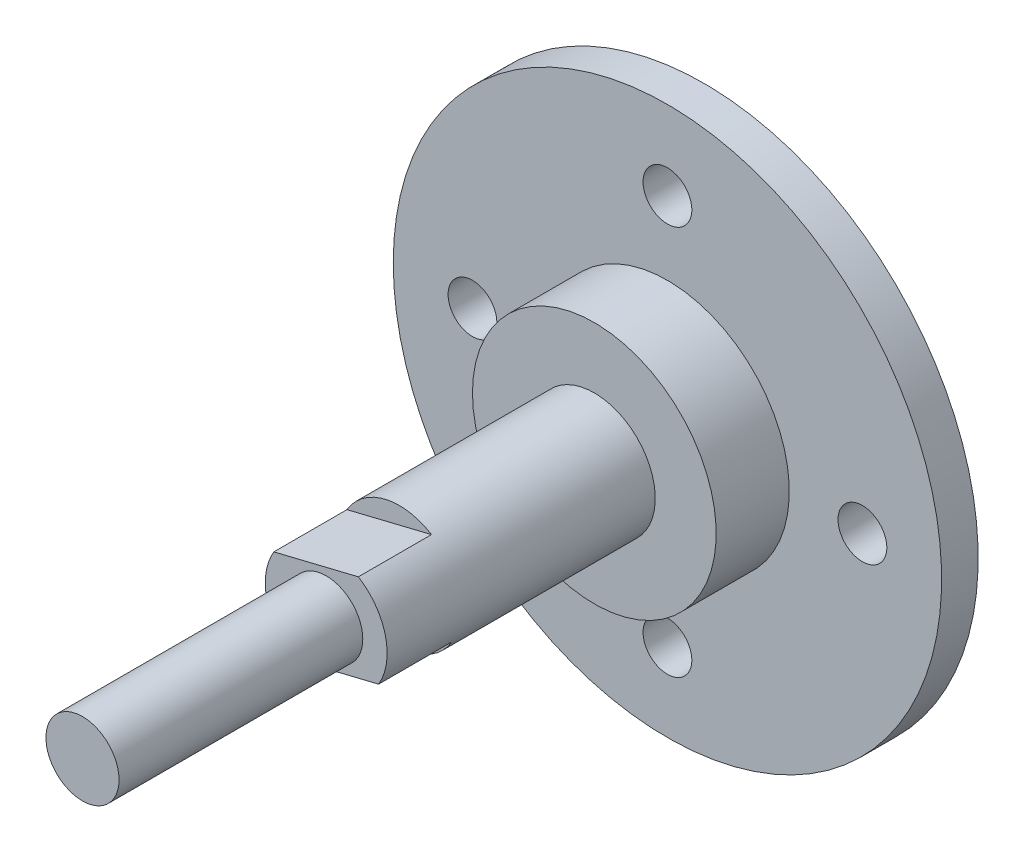
ISO-10303-21;
HEADER;
FILE_DESCRIPTION(('STEP AP214'),'2;1');
FILE_NAME('part.step','',(''),(''),'','','');
FILE_SCHEMA(('AUTOMOTIVE_DESIGN { 1 0 10303 214 1 1 1 1 }'));
ENDSEC;
DATA;
#1=APPLICATION_CONTEXT('core data for automotive mechanical design processes');
#2=APPLICATION_PROTOCOL_DEFINITION('international standard','automotive_design',2000,#1);
#3=PRODUCT_CONTEXT('',#1,'mechanical');
#4=PRODUCT('Part','Part','',(#3));
#5=PRODUCT_RELATED_PRODUCT_CATEGORY('part','',(#4));
#6=PRODUCT_DEFINITION_FORMATION('','',#4);
#7=PRODUCT_DEFINITION_CONTEXT('part definition',#1,'design');
#8=PRODUCT_DEFINITION('design','',#6,#7);
#9=PRODUCT_DEFINITION_SHAPE('','',#8);
#10=(LENGTH_UNIT() NAMED_UNIT(*) SI_UNIT(.MILLI.,.METRE.));
#11=(NAMED_UNIT(*) PLANE_ANGLE_UNIT() SI_UNIT($,.RADIAN.));
#12=(NAMED_UNIT(*) SI_UNIT($,.STERADIAN.) SOLID_ANGLE_UNIT());
#13=UNCERTAINTY_MEASURE_WITH_UNIT(LENGTH_MEASURE(1.E-05),#10,'distance_accuracy_value','');
#14=(GEOMETRIC_REPRESENTATION_CONTEXT(3) GLOBAL_UNCERTAINTY_ASSIGNED_CONTEXT((#13)) GLOBAL_UNIT_ASSIGNED_CONTEXT((#10,
#11,#12)) REPRESENTATION_CONTEXT('',''));
#15=CARTESIAN_POINT('',(0.,0.,0.));
#16=DIRECTION('',(0.,0.,1.));
#17=DIRECTION('',(1.,0.,0.));
#18=AXIS2_PLACEMENT_3D('',#15,#16,#17);
#19=CARTESIAN_POINT('',(0.,0.,22.));
#20=DIRECTION('',(0.,0.,-1.));
#21=DIRECTION('',(-1.,0.,0.));
#22=AXIS2_PLACEMENT_3D('',#19,#20,#21);
#23=CYLINDRICAL_SURFACE('',#22,5.);
#24=CARTESIAN_POINT('',(0.,0.,22.));
#25=DIRECTION('',(0.,0.,1.));
#26=DIRECTION('',(1.,0.,0.));
#27=AXIS2_PLACEMENT_3D('',#24,#25,#26);
#28=CIRCLE('',#27,5.);
#29=CARTESIAN_POINT('',(4.29920810179687,-2.552804281069,22.));
#30=VERTEX_POINT('',#29);
#31=CARTESIAN_POINT('',(2.63827783118239,4.24729208855378,22.));
#32=VERTEX_POINT('',#31);
#33=EDGE_CURVE('E42',#30,#32,#28,.T.);
#34=ORIENTED_EDGE('',*,*,#33,.F.);
#35=DIRECTION('',(0.,0.,1.));
#36=VECTOR('',#35,1.);
#37=CARTESIAN_POINT('',(4.29920810179687,-2.55280428106899,16.));
#38=LINE('',#37,#36);
#39=CARTESIAN_POINT('',(4.29920810179687,-2.55280428106899,16.));
#40=VERTEX_POINT('',#39);
#41=EDGE_CURVE('E49',#40,#30,#38,.T.);
#42=ORIENTED_EDGE('',*,*,#41,.F.);
#43=CARTESIAN_POINT('',(0.,0.,16.));
#44=DIRECTION('',(0.,0.,1.));
#45=DIRECTION('',(1.,0.,0.));
#46=AXIS2_PLACEMENT_3D('',#43,#44,#45);
#47=CIRCLE('',#46,5.);
#48=CARTESIAN_POINT('',(-2.63827783118242,-4.24729208855376,16.));
#49=VERTEX_POINT('',#48);
#50=EDGE_CURVE('E78',#49,#40,#47,.T.);
#51=ORIENTED_EDGE('',*,*,#50,.F.);
#52=DIRECTION('',(0.,0.,1.));
#53=VECTOR('',#52,1.);
#54=CARTESIAN_POINT('',(-2.63827783118242,-4.24729208855376,16.));
#55=LINE('',#54,#53);
#56=CARTESIAN_POINT('',(-2.63827783118242,-4.24729208855376,22.));
#57=VERTEX_POINT('',#56);
#58=EDGE_CURVE('E86',#49,#57,#55,.T.);
#59=ORIENTED_EDGE('',*,*,#58,.T.);
#60=CARTESIAN_POINT('',(-4.29920810179688,2.55280428106897,22.));
#61=VERTEX_POINT('',#60);
#62=EDGE_CURVE('E11',#61,#57,#28,.T.);
#63=ORIENTED_EDGE('',*,*,#62,.F.);
#64=DIRECTION('',(0.,0.,1.));
#65=VECTOR('',#64,1.);
#66=CARTESIAN_POINT('',(-4.29920810179688,2.55280428106897,16.));
#67=LINE('',#66,#65);
#68=CARTESIAN_POINT('',(-4.29920810179688,2.55280428106897,16.));
#69=VERTEX_POINT('',#68);
#70=EDGE_CURVE('E57',#69,#61,#67,.T.);
#71=ORIENTED_EDGE('',*,*,#70,.F.);
#72=CARTESIAN_POINT('',(0.,0.,16.));
#73=DIRECTION('',(0.,0.,1.));
#74=DIRECTION('',(1.,0.,0.));
#75=AXIS2_PLACEMENT_3D('',#72,#73,#74);
#76=CIRCLE('',#75,5.);
#77=CARTESIAN_POINT('',(2.63827783118239,4.24729208855378,16.));
#78=VERTEX_POINT('',#77);
#79=EDGE_CURVE('E96',#78,#69,#76,.T.);
#80=ORIENTED_EDGE('',*,*,#79,.F.);
#81=DIRECTION('',(0.,0.,1.));
#82=VECTOR('',#81,1.);
#83=CARTESIAN_POINT('',(2.63827783118239,4.24729208855378,16.));
#84=LINE('',#83,#82);
#85=EDGE_CURVE('E102',#78,#32,#84,.T.);
#86=ORIENTED_EDGE('',*,*,#85,.T.);
#87=EDGE_LOOP('',(#34,#42,#51,#59,#63,#71,#80,#86));
#88=FACE_BOUND('',#87,.T.);
#89=CARTESIAN_POINT('',(0.,0.,0.));
#90=DIRECTION('',(0.,0.,-1.));
#91=DIRECTION('',(-1.,0.,0.));
#92=AXIS2_PLACEMENT_3D('',#89,#90,#91);
#93=CIRCLE('',#92,5.);
#94=CARTESIAN_POINT('',(-5.,0.,0.));
#95=VERTEX_POINT('',#94);
#96=EDGE_CURVE('E130',#95,#95,#93,.T.);
#97=ORIENTED_EDGE('',*,*,#96,.F.);
#98=EDGE_LOOP('',(#97));
#99=FACE_BOUND('',#98,.T.);
#100=ADVANCED_FACE('F35',(#88,#99),#23,.T.);
#101=CARTESIAN_POINT('',(0.,0.,22.));
#102=DIRECTION('',(0.,0.,1.));
#103=DIRECTION('',(1.,0.,0.));
#104=AXIS2_PLACEMENT_3D('',#101,#102,#103);
#105=PLANE('',#104);
#106=CARTESIAN_POINT('',(0.,0.,22.));
#107=DIRECTION('',(0.,0.,1.));
#108=DIRECTION('',(1.,0.,0.));
#109=AXIS2_PLACEMENT_3D('',#106,#107,#108);
#110=CIRCLE('',#109,3.);
#111=CARTESIAN_POINT('',(3.,0.,22.));
#112=VERTEX_POINT('',#111);
#113=EDGE_CURVE('E127',#112,#112,#110,.T.);
#114=ORIENTED_EDGE('',*,*,#113,.F.);
#115=EDGE_LOOP('',(#114));
#116=FACE_BOUND('',#115,.T.);
#117=DIRECTION('',(-0.971442338517537,-0.237275752944921,0.));
#118=VECTOR('',#117,1.);
#119=CARTESIAN_POINT('',(-2.63827783118242,-4.24729208855376,22.));
#120=LINE('',#119,#118);
#121=EDGE_CURVE('E83',#30,#57,#120,.T.);
#122=ORIENTED_EDGE('',*,*,#121,.F.);
#123=ORIENTED_EDGE('',*,*,#33,.T.);
#124=DIRECTION('',(0.971442338517535,0.237275752944928,0.));
#125=VECTOR('',#124,1.);
#126=CARTESIAN_POINT('',(2.63827783118239,4.24729208855378,22.));
#127=LINE('',#126,#125);
#128=EDGE_CURVE('E92',#61,#32,#127,.T.);
#129=ORIENTED_EDGE('',*,*,#128,.F.);
#130=ORIENTED_EDGE('',*,*,#62,.T.);
#131=EDGE_LOOP('',(#122,#123,#129,#130));
#132=FACE_BOUND('',#131,.T.);
#133=ADVANCED_FACE('F105',(#116,#132),#105,.T.);
#134=CARTESIAN_POINT('',(2.63827783118239,4.24729208855378,16.));
#135=DIRECTION('',(0.237275752944928,-0.971442338517535,0.));
#136=DIRECTION('',(0.971442338517535,0.237275752944928,0.));
#137=AXIS2_PLACEMENT_3D('',#134,#135,#136);
#138=PLANE('',#137);
#139=ORIENTED_EDGE('',*,*,#128,.T.);
#140=ORIENTED_EDGE('',*,*,#85,.F.);
#141=DIRECTION('',(0.971442338517535,0.237275752944928,0.));
#142=VECTOR('',#141,1.);
#143=CARTESIAN_POINT('',(2.63827783118239,4.24729208855378,16.));
#144=LINE('',#143,#142);
#145=EDGE_CURVE('E98',#69,#78,#144,.T.);
#146=ORIENTED_EDGE('',*,*,#145,.F.);
#147=ORIENTED_EDGE('',*,*,#70,.T.);
#148=EDGE_LOOP('',(#139,#140,#146,#147));
#149=FACE_BOUND('',#148,.T.);
#150=ADVANCED_FACE('F107',(#149),#138,.F.);
#151=CARTESIAN_POINT('',(0.,0.,16.));
#152=DIRECTION('',(0.,0.,1.));
#153=DIRECTION('',(1.,0.,0.));
#154=AXIS2_PLACEMENT_3D('',#151,#152,#153);
#155=PLANE('',#154);
#156=ORIENTED_EDGE('',*,*,#79,.T.);
#157=ORIENTED_EDGE('',*,*,#145,.T.);
#158=EDGE_LOOP('',(#156,#157));
#159=FACE_BOUND('',#158,.T.);
#160=ADVANCED_FACE('F109',(#159),#155,.T.);
#161=CARTESIAN_POINT('',(-2.63827783118242,-4.24729208855376,16.));
#162=DIRECTION('',(-0.237275752944921,0.971442338517537,0.));
#163=DIRECTION('',(-0.971442338517537,-0.237275752944921,0.));
#164=AXIS2_PLACEMENT_3D('',#161,#162,#163);
#165=PLANE('',#164);
#166=ORIENTED_EDGE('',*,*,#121,.T.);
#167=ORIENTED_EDGE('',*,*,#58,.F.);
#168=DIRECTION('',(-0.971442338517537,-0.237275752944921,0.));
#169=VECTOR('',#168,1.);
#170=CARTESIAN_POINT('',(-2.63827783118242,-4.24729208855376,16.));
#171=LINE('',#170,#169);
#172=EDGE_CURVE('E80',#40,#49,#171,.T.);
#173=ORIENTED_EDGE('',*,*,#172,.F.);
#174=ORIENTED_EDGE('',*,*,#41,.T.);
#175=EDGE_LOOP('',(#166,#167,#173,#174));
#176=FACE_BOUND('',#175,.T.);
#177=ADVANCED_FACE('F85',(#176),#165,.F.);
#178=CARTESIAN_POINT('',(0.,0.,16.));
#179=DIRECTION('',(0.,0.,1.));
#180=DIRECTION('',(1.,0.,0.));
#181=AXIS2_PLACEMENT_3D('',#178,#179,#180);
#182=PLANE('',#181);
#183=ORIENTED_EDGE('',*,*,#50,.T.);
#184=ORIENTED_EDGE('',*,*,#172,.T.);
#185=EDGE_LOOP('',(#183,#184));
#186=FACE_BOUND('',#185,.T.);
#187=ADVANCED_FACE('F79',(#186),#182,.T.);
#188=CARTESIAN_POINT('',(0.,0.,42.));
#189=DIRECTION('',(0.,0.,-1.));
#190=DIRECTION('',(-1.,0.,0.));
#191=AXIS2_PLACEMENT_3D('',#188,#189,#190);
#192=CYLINDRICAL_SURFACE('',#191,3.);
#193=CARTESIAN_POINT('',(0.,0.,42.));
#194=DIRECTION('',(0.,0.,1.));
#195=DIRECTION('',(1.,0.,0.));
#196=AXIS2_PLACEMENT_3D('',#193,#194,#195);
#197=CIRCLE('',#196,3.);
#198=CARTESIAN_POINT('',(3.,0.,42.));
#199=VERTEX_POINT('',#198);
#200=EDGE_CURVE('E129',#199,#199,#197,.T.);
#201=ORIENTED_EDGE('',*,*,#200,.F.);
#202=EDGE_LOOP('',(#201));
#203=FACE_BOUND('',#202,.T.);
#204=ORIENTED_EDGE('',*,*,#113,.T.);
#205=EDGE_LOOP('',(#204));
#206=FACE_BOUND('',#205,.T.);
#207=ADVANCED_FACE('F223',(#203,#206),#192,.T.);
#208=CARTESIAN_POINT('',(0.,0.,42.));
#209=DIRECTION('',(0.,0.,1.));
#210=DIRECTION('',(1.,0.,0.));
#211=AXIS2_PLACEMENT_3D('',#208,#209,#210);
#212=PLANE('',#211);
#213=ORIENTED_EDGE('',*,*,#200,.T.);
#214=EDGE_LOOP('',(#213));
#215=FACE_BOUND('',#214,.T.);
#216=ADVANCED_FACE('F219',(#215),#212,.T.);
#217=CARTESIAN_POINT('',(0.,0.,-6.));
#218=DIRECTION('',(0.,0.,1.));
#219=DIRECTION('',(1.,0.,0.));
#220=AXIS2_PLACEMENT_3D('',#217,#218,#219);
#221=CYLINDRICAL_SURFACE('',#220,10.);
#222=CARTESIAN_POINT('',(0.,0.,-6.));
#223=DIRECTION('',(0.,0.,-1.));
#224=DIRECTION('',(-1.,0.,0.));
#225=AXIS2_PLACEMENT_3D('',#222,#223,#224);
#226=CIRCLE('',#225,10.);
#227=CARTESIAN_POINT('',(-10.,0.,-6.));
#228=VERTEX_POINT('',#227);
#229=EDGE_CURVE('E135',#228,#228,#226,.T.);
#230=ORIENTED_EDGE('',*,*,#229,.F.);
#231=EDGE_LOOP('',(#230));
#232=FACE_BOUND('',#231,.T.);
#233=CARTESIAN_POINT('',(0.,0.,0.));
#234=DIRECTION('',(0.,0.,-1.));
#235=DIRECTION('',(-1.,0.,0.));
#236=AXIS2_PLACEMENT_3D('',#233,#234,#235);
#237=CIRCLE('',#236,10.);
#238=CARTESIAN_POINT('',(-10.,0.,0.));
#239=VERTEX_POINT('',#238);
#240=EDGE_CURVE('E138',#239,#239,#237,.T.);
#241=ORIENTED_EDGE('',*,*,#240,.T.);
#242=EDGE_LOOP('',(#241));
#243=FACE_BOUND('',#242,.T.);
#244=ADVANCED_FACE('F215',(#232,#243),#221,.T.);
#245=CARTESIAN_POINT('',(0.,0.,0.));
#246=DIRECTION('',(0.,0.,-1.));
#247=DIRECTION('',(-1.,0.,0.));
#248=AXIS2_PLACEMENT_3D('',#245,#246,#247);
#249=PLANE('',#248);
#250=ORIENTED_EDGE('',*,*,#96,.T.);
#251=EDGE_LOOP('',(#250));
#252=FACE_BOUND('',#251,.T.);
#253=ORIENTED_EDGE('',*,*,#240,.F.);
#254=EDGE_LOOP('',(#253));
#255=FACE_BOUND('',#254,.T.);
#256=ADVANCED_FACE('F199',(#252,#255),#249,.F.);
#257=CARTESIAN_POINT('',(-8.43991331030423E-12,-9.76824472042855E-12,-9.));
#258=DIRECTION('',(0.,0.,1.));
#259=DIRECTION('',(1.,0.,0.));
#260=AXIS2_PLACEMENT_3D('',#257,#258,#259);
#261=CYLINDRICAL_SURFACE('',#260,22.499999999994);
#262=CARTESIAN_POINT('',(-8.43991331030423E-12,-9.76824472042855E-12,-9.));
#263=DIRECTION('',(0.,0.,-1.));
#264=DIRECTION('',(-1.,0.,0.));
#265=AXIS2_PLACEMENT_3D('',#262,#263,#264);
#266=CIRCLE('',#265,22.499999999994);
#267=CARTESIAN_POINT('',(-22.5000000000024,-9.76824472042855E-12,-9.));
#268=VERTEX_POINT('',#267);
#269=EDGE_CURVE('E141',#268,#268,#266,.T.);
#270=ORIENTED_EDGE('',*,*,#269,.F.);
#271=EDGE_LOOP('',(#270));
#272=FACE_BOUND('',#271,.T.);
#273=CARTESIAN_POINT('',(-8.43991331030423E-12,-9.76824472042855E-12,-6.));
#274=DIRECTION('',(0.,0.,-1.));
#275=DIRECTION('',(-1.,0.,0.));
#276=AXIS2_PLACEMENT_3D('',#273,#274,#275);
#277=CIRCLE('',#276,22.499999999994);
#278=CARTESIAN_POINT('',(-22.5000000000024,-9.76824472042855E-12,-6.));
#279=VERTEX_POINT('',#278);
#280=EDGE_CURVE('E144',#279,#279,#277,.T.);
#281=ORIENTED_EDGE('',*,*,#280,.T.);
#282=EDGE_LOOP('',(#281));
#283=FACE_BOUND('',#282,.T.);
#284=ADVANCED_FACE('F187',(#272,#283),#261,.T.);
#285=CARTESIAN_POINT('',(-8.43991331030423E-12,-9.76824472042855E-12,-9.));
#286=DIRECTION('',(0.,0.,-1.));
#287=DIRECTION('',(-1.,0.,0.));
#288=AXIS2_PLACEMENT_3D('',#285,#286,#287);
#289=PLANE('',#288);
#290=CARTESIAN_POINT('',(0.,16.0000000000009,-9.));
#291=DIRECTION('',(0.,0.,-1.));
#292=DIRECTION('',(-1.,0.,0.));
#293=AXIS2_PLACEMENT_3D('',#290,#291,#292);
#294=CIRCLE('',#293,2.00000000000086);
#295=CARTESIAN_POINT('',(-2.00000000000086,16.0000000000009,-9.));
#296=VERTEX_POINT('',#295);
#297=EDGE_CURVE('E168',#296,#296,#294,.T.);
#298=ORIENTED_EDGE('',*,*,#297,.F.);
#299=EDGE_LOOP('',(#298));
#300=FACE_BOUND('',#299,.T.);
#301=CARTESIAN_POINT('',(-16.0000000000009,0.,-9.));
#302=DIRECTION('',(0.,0.,-1.));
#303=DIRECTION('',(-1.,0.,0.));
#304=AXIS2_PLACEMENT_3D('',#301,#302,#303);
#305=CIRCLE('',#304,2.00000000000087);
#306=CARTESIAN_POINT('',(-18.0000000000018,0.,-9.));
#307=VERTEX_POINT('',#306);
#308=EDGE_CURVE('E162',#307,#307,#305,.T.);
#309=ORIENTED_EDGE('',*,*,#308,.F.);
#310=EDGE_LOOP('',(#309));
#311=FACE_BOUND('',#310,.T.);
#312=CARTESIAN_POINT('',(0.,-16.0000000000009,-9.));
#313=DIRECTION('',(0.,0.,-1.));
#314=DIRECTION('',(-1.,0.,0.));
#315=AXIS2_PLACEMENT_3D('',#312,#313,#314);
#316=CIRCLE('',#315,2.0000000000009);
#317=CARTESIAN_POINT('',(-2.0000000000009,-16.0000000000009,-9.));
#318=VERTEX_POINT('',#317);
#319=EDGE_CURVE('E156',#318,#318,#316,.T.);
#320=ORIENTED_EDGE('',*,*,#319,.F.);
#321=EDGE_LOOP('',(#320));
#322=FACE_BOUND('',#321,.T.);
#323=CARTESIAN_POINT('',(16.0000000000009,0.,-9.));
#324=DIRECTION('',(0.,0.,-1.));
#325=DIRECTION('',(-1.,0.,0.));
#326=AXIS2_PLACEMENT_3D('',#323,#324,#325);
#327=CIRCLE('',#326,2.00000000000084);
#328=CARTESIAN_POINT('',(14.,0.,-9.));
#329=VERTEX_POINT('',#328);
#330=EDGE_CURVE('E150',#329,#329,#327,.T.);
#331=ORIENTED_EDGE('',*,*,#330,.F.);
#332=EDGE_LOOP('',(#331));
#333=FACE_BOUND('',#332,.T.);
#334=ORIENTED_EDGE('',*,*,#269,.T.);
#335=EDGE_LOOP('',(#334));
#336=FACE_BOUND('',#335,.T.);
#337=ADVANCED_FACE('F184',(#300,#311,#322,#333,#336),#289,.T.);
#338=CARTESIAN_POINT('',(-8.43991331030423E-12,-9.76824472042855E-12,-6.));
#339=DIRECTION('',(0.,0.,-1.));
#340=DIRECTION('',(-1.,0.,0.));
#341=AXIS2_PLACEMENT_3D('',#338,#339,#340);
#342=PLANE('',#341);
#343=CARTESIAN_POINT('',(0.,16.0000000000009,-6.));
#344=DIRECTION('',(0.,0.,-1.));
#345=DIRECTION('',(-1.,0.,0.));
#346=AXIS2_PLACEMENT_3D('',#343,#344,#345);
#347=CIRCLE('',#346,2.00000000000086);
#348=CARTESIAN_POINT('',(-2.00000000000086,16.0000000000009,-6.));
#349=VERTEX_POINT('',#348);
#350=EDGE_CURVE('E153',#349,#349,#347,.T.);
#351=ORIENTED_EDGE('',*,*,#350,.T.);
#352=EDGE_LOOP('',(#351));
#353=FACE_BOUND('',#352,.T.);
#354=CARTESIAN_POINT('',(-16.0000000000009,0.,-6.));
#355=DIRECTION('',(0.,0.,-1.));
#356=DIRECTION('',(-1.,0.,0.));
#357=AXIS2_PLACEMENT_3D('',#354,#355,#356);
#358=CIRCLE('',#357,2.00000000000087);
#359=CARTESIAN_POINT('',(-18.0000000000018,0.,-6.));
#360=VERTEX_POINT('',#359);
#361=EDGE_CURVE('E165',#360,#360,#358,.T.);
#362=ORIENTED_EDGE('',*,*,#361,.T.);
#363=EDGE_LOOP('',(#362));
#364=FACE_BOUND('',#363,.T.);
#365=CARTESIAN_POINT('',(0.,-16.0000000000009,-6.));
#366=DIRECTION('',(0.,0.,-1.));
#367=DIRECTION('',(-1.,0.,0.));
#368=AXIS2_PLACEMENT_3D('',#365,#366,#367);
#369=CIRCLE('',#368,2.0000000000009);
#370=CARTESIAN_POINT('',(-2.0000000000009,-16.0000000000009,-6.));
#371=VERTEX_POINT('',#370);
#372=EDGE_CURVE('E159',#371,#371,#369,.T.);
#373=ORIENTED_EDGE('',*,*,#372,.T.);
#374=EDGE_LOOP('',(#373));
#375=FACE_BOUND('',#374,.T.);
#376=CARTESIAN_POINT('',(16.0000000000009,0.,-6.));
#377=DIRECTION('',(0.,0.,-1.));
#378=DIRECTION('',(-1.,0.,0.));
#379=AXIS2_PLACEMENT_3D('',#376,#377,#378);
#380=CIRCLE('',#379,2.00000000000084);
#381=CARTESIAN_POINT('',(14.,0.,-6.));
#382=VERTEX_POINT('',#381);
#383=EDGE_CURVE('E147',#382,#382,#380,.T.);
#384=ORIENTED_EDGE('',*,*,#383,.T.);
#385=EDGE_LOOP('',(#384));
#386=FACE_BOUND('',#385,.T.);
#387=ORIENTED_EDGE('',*,*,#229,.T.);
#388=EDGE_LOOP('',(#387));
#389=FACE_BOUND('',#388,.T.);
#390=ORIENTED_EDGE('',*,*,#280,.F.);
#391=EDGE_LOOP('',(#390));
#392=FACE_BOUND('',#391,.T.);
#393=ADVANCED_FACE('F174',(#353,#364,#375,#386,#389,#392),#342,.F.);
#394=CARTESIAN_POINT('',(16.0000000000009,0.,-6.));
#395=DIRECTION('',(0.,0.,-1.));
#396=DIRECTION('',(-1.,0.,0.));
#397=AXIS2_PLACEMENT_3D('',#394,#395,#396);
#398=CYLINDRICAL_SURFACE('',#397,2.00000000000084);
#399=ORIENTED_EDGE('',*,*,#383,.F.);
#400=EDGE_LOOP('',(#399));
#401=FACE_BOUND('',#400,.T.);
#402=ORIENTED_EDGE('',*,*,#330,.T.);
#403=EDGE_LOOP('',(#402));
#404=FACE_BOUND('',#403,.T.);
#405=ADVANCED_FACE('F204',(#401,#404),#398,.F.);
#406=CARTESIAN_POINT('',(0.,-16.0000000000009,-6.));
#407=DIRECTION('',(0.,0.,-1.));
#408=DIRECTION('',(-1.,0.,0.));
#409=AXIS2_PLACEMENT_3D('',#406,#407,#408);
#410=CYLINDRICAL_SURFACE('',#409,2.0000000000009);
#411=ORIENTED_EDGE('',*,*,#372,.F.);
#412=EDGE_LOOP('',(#411));
#413=FACE_BOUND('',#412,.T.);
#414=ORIENTED_EDGE('',*,*,#319,.T.);
#415=EDGE_LOOP('',(#414));
#416=FACE_BOUND('',#415,.T.);
#417=ADVANCED_FACE('F209',(#413,#416),#410,.F.);
#418=CARTESIAN_POINT('',(-16.0000000000009,0.,-6.));
#419=DIRECTION('',(0.,0.,-1.));
#420=DIRECTION('',(-1.,0.,0.));
#421=AXIS2_PLACEMENT_3D('',#418,#419,#420);
#422=CYLINDRICAL_SURFACE('',#421,2.00000000000087);
#423=ORIENTED_EDGE('',*,*,#361,.F.);
#424=EDGE_LOOP('',(#423));
#425=FACE_BOUND('',#424,.T.);
#426=ORIENTED_EDGE('',*,*,#308,.T.);
#427=EDGE_LOOP('',(#426));
#428=FACE_BOUND('',#427,.T.);
#429=ADVANCED_FACE('F180',(#425,#428),#422,.F.);
#430=CARTESIAN_POINT('',(0.,16.0000000000009,-6.));
#431=DIRECTION('',(0.,0.,-1.));
#432=DIRECTION('',(-1.,0.,0.));
#433=AXIS2_PLACEMENT_3D('',#430,#431,#432);
#434=CYLINDRICAL_SURFACE('',#433,2.00000000000086);
#435=ORIENTED_EDGE('',*,*,#350,.F.);
#436=EDGE_LOOP('',(#435));
#437=FACE_BOUND('',#436,.T.);
#438=ORIENTED_EDGE('',*,*,#297,.T.);
#439=EDGE_LOOP('',(#438));
#440=FACE_BOUND('',#439,.T.);
#441=ADVANCED_FACE('F177',(#437,#440),#434,.F.);
#442=CLOSED_SHELL('',(#100,#133,#150,#160,#177,#187,#207,#216,#244,#256,#284,#337,#393,#405,
#417,#429,#441));
#443=MANIFOLD_SOLID_BREP('B2',#442);
#444=ADVANCED_BREP_SHAPE_REPRESENTATION('',(#18,#443),#14);
#445=SHAPE_DEFINITION_REPRESENTATION(#9,#444);
ENDSEC;
END-ISO-10303-21;
